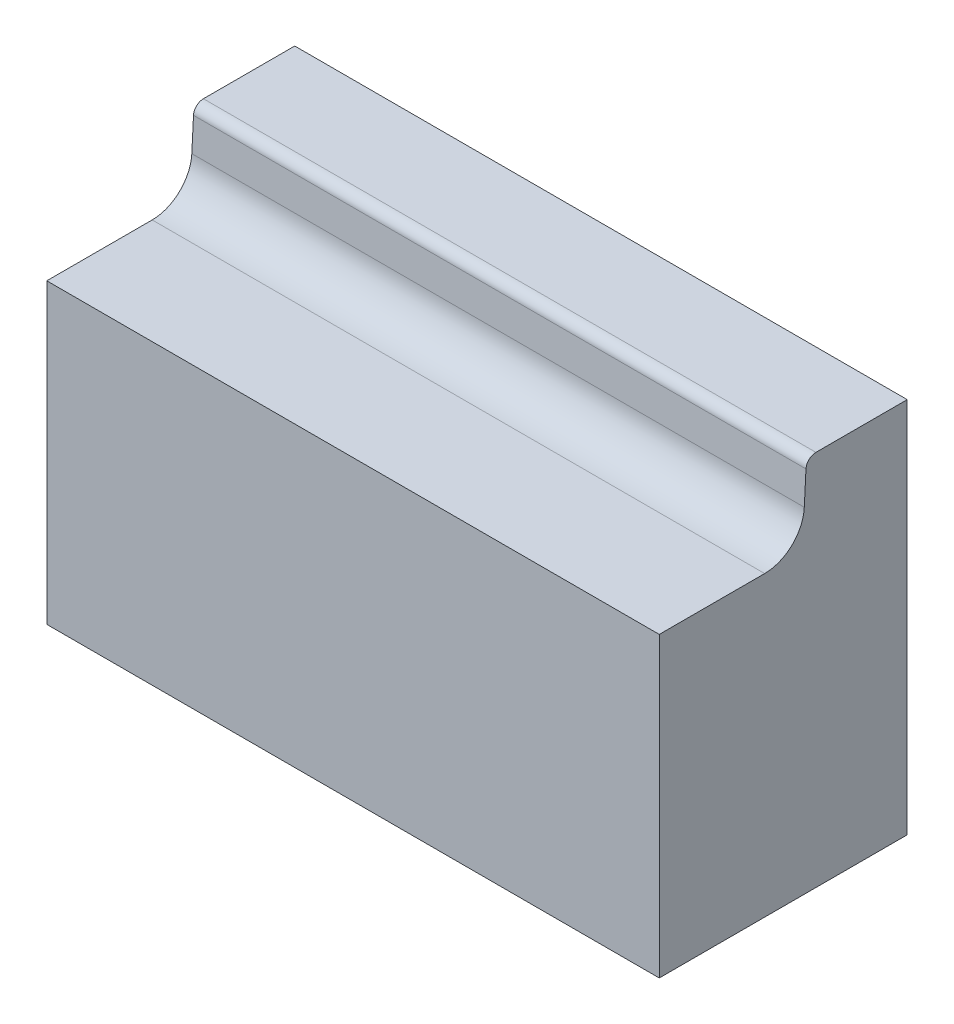
ISO-10303-21;
HEADER;
FILE_DESCRIPTION(('STEP AP214'),'2;1');
FILE_NAME('part.step','',(''),(''),'','','');
FILE_SCHEMA(('AUTOMOTIVE_DESIGN { 1 0 10303 214 1 1 1 1 }'));
ENDSEC;
DATA;
#1=APPLICATION_CONTEXT('core data for automotive mechanical design processes');
#2=APPLICATION_PROTOCOL_DEFINITION('international standard','automotive_design',2000,#1);
#3=PRODUCT_CONTEXT('',#1,'mechanical');
#4=PRODUCT('Part','Part','',(#3));
#5=PRODUCT_RELATED_PRODUCT_CATEGORY('part','',(#4));
#6=PRODUCT_DEFINITION_FORMATION('','',#4);
#7=PRODUCT_DEFINITION_CONTEXT('part definition',#1,'design');
#8=PRODUCT_DEFINITION('design','',#6,#7);
#9=PRODUCT_DEFINITION_SHAPE('','',#8);
#10=(LENGTH_UNIT() NAMED_UNIT(*) SI_UNIT(.MILLI.,.METRE.));
#11=(NAMED_UNIT(*) PLANE_ANGLE_UNIT() SI_UNIT($,.RADIAN.));
#12=(NAMED_UNIT(*) SI_UNIT($,.STERADIAN.) SOLID_ANGLE_UNIT());
#13=UNCERTAINTY_MEASURE_WITH_UNIT(LENGTH_MEASURE(1.E-05),#10,'distance_accuracy_value','');
#14=(GEOMETRIC_REPRESENTATION_CONTEXT(3) GLOBAL_UNCERTAINTY_ASSIGNED_CONTEXT((#13)) GLOBAL_UNIT_ASSIGNED_CONTEXT((#10,
#11,#12)) REPRESENTATION_CONTEXT('',''));
#15=CARTESIAN_POINT('',(0.,0.,0.));
#16=DIRECTION('',(0.,0.,1.));
#17=DIRECTION('',(1.,0.,0.));
#18=AXIS2_PLACEMENT_3D('',#15,#16,#17);
#19=CARTESIAN_POINT('',(6.10646555692893,-38.,12.5));
#20=DIRECTION('',(1.,0.,0.));
#21=DIRECTION('',(0.,0.,-1.));
#22=AXIS2_PLACEMENT_3D('',#19,#20,#21);
#23=PLANE('',#22);
#24=DIRECTION('',(0.,-0.998629534754574,0.052335956242941));
#25=VECTOR('',#24,1.);
#26=CARTESIAN_POINT('',(6.10646555692893,0.,-2.34275441810969));
#27=LINE('',#26,#25);
#28=CARTESIAN_POINT('',(6.10646555692893,-0.947664043757059,-2.29308945007));
#29=VERTEX_POINT('',#28);
#30=CARTESIAN_POINT('',(6.10646555692893,-4.20934382497176,-2.12215205600415));
#31=VERTEX_POINT('',#30);
#32=EDGE_CURVE('E154',#29,#31,#27,.T.);
#33=ORIENTED_EDGE('',*,*,#32,.F.);
#34=CARTESIAN_POINT('',(6.10646555692893,-1.,-3.29171898482457));
#35=DIRECTION('',(1.,0.,0.));
#36=DIRECTION('',(0.,0.,-1.));
#37=AXIS2_PLACEMENT_3D('',#34,#35,#36);
#38=CIRCLE('',#37,1.);
#39=CARTESIAN_POINT('',(6.10646555692893,0.,-3.29171898482457));
#40=VERTEX_POINT('',#39);
#41=EDGE_CURVE('E11',#29,#40,#38,.F.);
#42=ORIENTED_EDGE('',*,*,#41,.T.);
#43=DIRECTION('',(0.,0.,-1.));
#44=VECTOR('',#43,1.);
#45=CARTESIAN_POINT('',(6.10646555692893,0.,12.5));
#46=LINE('',#45,#44);
#47=CARTESIAN_POINT('',(6.10646555692893,0.,-12.5));
#48=VERTEX_POINT('',#47);
#49=EDGE_CURVE('E168',#40,#48,#46,.T.);
#50=ORIENTED_EDGE('',*,*,#49,.T.);
#51=DIRECTION('',(0.,-1.,0.));
#52=VECTOR('',#51,1.);
#53=CARTESIAN_POINT('',(6.10646555692893,-38.,-12.5));
#54=LINE('',#53,#52);
#55=CARTESIAN_POINT('',(6.10646555692893,-38.,-12.5));
#56=VERTEX_POINT('',#55);
#57=EDGE_CURVE('E159',#48,#56,#54,.T.);
#58=ORIENTED_EDGE('',*,*,#57,.T.);
#59=DIRECTION('',(0.,0.,-1.));
#60=VECTOR('',#59,1.);
#61=CARTESIAN_POINT('',(6.10646555692893,-38.,12.5));
#62=LINE('',#61,#60);
#63=CARTESIAN_POINT('',(6.10646555692893,-38.,12.5));
#64=VERTEX_POINT('',#63);
#65=EDGE_CURVE('E184',#64,#56,#62,.T.);
#66=ORIENTED_EDGE('',*,*,#65,.F.);
#67=DIRECTION('',(0.,-1.,0.));
#68=VECTOR('',#67,1.);
#69=CARTESIAN_POINT('',(6.10646555692893,-38.,12.5));
#70=LINE('',#69,#68);
#71=CARTESIAN_POINT('',(6.10646555692893,-8.,12.5));
#72=VERTEX_POINT('',#71);
#73=EDGE_CURVE('E160',#72,#64,#70,.T.);
#74=ORIENTED_EDGE('',*,*,#73,.F.);
#75=DIRECTION('',(0.,0.,1.));
#76=VECTOR('',#75,1.);
#77=CARTESIAN_POINT('',(6.10646555692893,-8.,12.5));
#78=LINE('',#77,#76);
#79=CARTESIAN_POINT('',(6.10646555692893,-8.,1.87236608301415));
#80=VERTEX_POINT('',#79);
#81=EDGE_CURVE('E141',#80,#72,#78,.T.);
#82=ORIENTED_EDGE('',*,*,#81,.F.);
#83=CARTESIAN_POINT('',(6.10646555692893,-4.,1.87236608301416));
#84=DIRECTION('',(1.,0.,0.));
#85=DIRECTION('',(0.,0.,-1.));
#86=AXIS2_PLACEMENT_3D('',#83,#84,#85);
#87=CIRCLE('',#86,4.);
#88=EDGE_CURVE('E138',#31,#80,#87,.F.);
#89=ORIENTED_EDGE('',*,*,#88,.F.);
#90=EDGE_LOOP('',(#33,#42,#50,#58,#66,#74,#82,#89));
#91=FACE_BOUND('',#90,.T.);
#92=ADVANCED_FACE('F49',(#91),#23,.F.);
#93=CARTESIAN_POINT('',(6.10646555692893,-38.,12.5));
#94=DIRECTION('',(0.,1.,0.));
#95=DIRECTION('',(0.,0.,1.));
#96=AXIS2_PLACEMENT_3D('',#93,#94,#95);
#97=PLANE('',#96);
#98=CARTESIAN_POINT('',(57.9814655569289,-38.,0.));
#99=DIRECTION('',(0.,-1.,0.));
#100=DIRECTION('',(0.,0.,-1.));
#101=AXIS2_PLACEMENT_3D('',#98,#99,#100);
#102=CIRCLE('',#101,2.49999999999999);
#103=CARTESIAN_POINT('',(57.9814655569289,-38.,-2.49999999999998));
#104=VERTEX_POINT('',#103);
#105=EDGE_CURVE('E128',#104,#104,#102,.T.);
#106=ORIENTED_EDGE('',*,*,#105,.F.);
#107=EDGE_LOOP('',(#106));
#108=FACE_BOUND('',#107,.T.);
#109=CARTESIAN_POINT('',(15.9814655569289,-38.,0.));
#110=DIRECTION('',(0.,-1.,0.));
#111=DIRECTION('',(0.,0.,-1.));
#112=AXIS2_PLACEMENT_3D('',#109,#110,#111);
#113=CIRCLE('',#112,2.49999999999999);
#114=CARTESIAN_POINT('',(15.9814655569289,-38.,-2.49999999999999));
#115=VERTEX_POINT('',#114);
#116=EDGE_CURVE('E127',#115,#115,#113,.T.);
#117=ORIENTED_EDGE('',*,*,#116,.F.);
#118=EDGE_LOOP('',(#117));
#119=FACE_BOUND('',#118,.T.);
#120=DIRECTION('',(1.,0.,0.));
#121=VECTOR('',#120,1.);
#122=CARTESIAN_POINT('',(6.10646555692893,-38.,-12.5));
#123=LINE('',#122,#121);
#124=CARTESIAN_POINT('',(67.8564655569289,-38.,-12.5));
#125=VERTEX_POINT('',#124);
#126=EDGE_CURVE('E171',#56,#125,#123,.T.);
#127=ORIENTED_EDGE('',*,*,#126,.T.);
#128=DIRECTION('',(0.,0.,-1.));
#129=VECTOR('',#128,1.);
#130=CARTESIAN_POINT('',(67.8564655569289,-38.,12.5));
#131=LINE('',#130,#129);
#132=CARTESIAN_POINT('',(67.8564655569289,-38.,12.5));
#133=VERTEX_POINT('',#132);
#134=EDGE_CURVE('E181',#133,#125,#131,.T.);
#135=ORIENTED_EDGE('',*,*,#134,.F.);
#136=DIRECTION('',(1.,0.,0.));
#137=VECTOR('',#136,1.);
#138=CARTESIAN_POINT('',(6.10646555692893,-38.,12.5));
#139=LINE('',#138,#137);
#140=EDGE_CURVE('E162',#64,#133,#139,.T.);
#141=ORIENTED_EDGE('',*,*,#140,.F.);
#142=ORIENTED_EDGE('',*,*,#65,.T.);
#143=EDGE_LOOP('',(#127,#135,#141,#142));
#144=FACE_BOUND('',#143,.T.);
#145=ADVANCED_FACE('F221',(#108,#119,#144),#97,.F.);
#146=CARTESIAN_POINT('',(67.8564655569289,-38.,12.5));
#147=DIRECTION('',(-1.,0.,0.));
#148=DIRECTION('',(0.,0.,1.));
#149=AXIS2_PLACEMENT_3D('',#146,#147,#148);
#150=PLANE('',#149);
#151=DIRECTION('',(0.,0.,-1.));
#152=VECTOR('',#151,1.);
#153=CARTESIAN_POINT('',(67.8564655569289,0.,12.5));
#154=LINE('',#153,#152);
#155=CARTESIAN_POINT('',(67.8564655569289,0.,-3.29171898482457));
#156=VERTEX_POINT('',#155);
#157=CARTESIAN_POINT('',(67.8564655569289,0.,-12.5));
#158=VERTEX_POINT('',#157);
#159=EDGE_CURVE('E179',#156,#158,#154,.T.);
#160=ORIENTED_EDGE('',*,*,#159,.F.);
#161=CARTESIAN_POINT('',(67.8564655569289,-1.,-3.29171898482457));
#162=DIRECTION('',(-1.,0.,0.));
#163=DIRECTION('',(0.,0.,1.));
#164=AXIS2_PLACEMENT_3D('',#161,#162,#163);
#165=CIRCLE('',#164,1.);
#166=CARTESIAN_POINT('',(67.8564655569289,-0.947664043757059,-2.29308945007));
#167=VERTEX_POINT('',#166);
#168=EDGE_CURVE('E71',#156,#167,#165,.F.);
#169=ORIENTED_EDGE('',*,*,#168,.T.);
#170=DIRECTION('',(0.,0.998629534754574,-0.0523359562429409));
#171=VECTOR('',#170,1.);
#172=CARTESIAN_POINT('',(67.8564655569289,0.,-2.34275441810969));
#173=LINE('',#172,#171);
#174=CARTESIAN_POINT('',(67.8564655569289,-4.20934382497176,-2.12215205600415));
#175=VERTEX_POINT('',#174);
#176=EDGE_CURVE('E146',#175,#167,#173,.T.);
#177=ORIENTED_EDGE('',*,*,#176,.F.);
#178=CARTESIAN_POINT('',(67.8564655569289,-4.,1.87236608301416));
#179=DIRECTION('',(1.,0.,0.));
#180=DIRECTION('',(0.,0.,-1.));
#181=AXIS2_PLACEMENT_3D('',#178,#179,#180);
#182=CIRCLE('',#181,4.);
#183=CARTESIAN_POINT('',(67.8564655569289,-8.,1.87236608301415));
#184=VERTEX_POINT('',#183);
#185=EDGE_CURVE('E143',#184,#175,#182,.T.);
#186=ORIENTED_EDGE('',*,*,#185,.F.);
#187=DIRECTION('',(0.,0.,-1.));
#188=VECTOR('',#187,1.);
#189=CARTESIAN_POINT('',(67.8564655569289,-8.,12.5));
#190=LINE('',#189,#188);
#191=CARTESIAN_POINT('',(67.8564655569289,-8.,12.5));
#192=VERTEX_POINT('',#191);
#193=EDGE_CURVE('E148',#192,#184,#190,.T.);
#194=ORIENTED_EDGE('',*,*,#193,.F.);
#195=DIRECTION('',(0.,1.,0.));
#196=VECTOR('',#195,1.);
#197=CARTESIAN_POINT('',(67.8564655569289,-38.,12.5));
#198=LINE('',#197,#196);
#199=EDGE_CURVE('E165',#133,#192,#198,.T.);
#200=ORIENTED_EDGE('',*,*,#199,.F.);
#201=ORIENTED_EDGE('',*,*,#134,.T.);
#202=DIRECTION('',(0.,1.,0.));
#203=VECTOR('',#202,1.);
#204=CARTESIAN_POINT('',(67.8564655569289,-38.,-12.5));
#205=LINE('',#204,#203);
#206=EDGE_CURVE('E173',#125,#158,#205,.T.);
#207=ORIENTED_EDGE('',*,*,#206,.T.);
#208=EDGE_LOOP('',(#160,#169,#177,#186,#194,#200,#201,#207));
#209=FACE_BOUND('',#208,.T.);
#210=ADVANCED_FACE('F196',(#209),#150,.F.);
#211=CARTESIAN_POINT('',(6.10646555692893,0.,12.5));
#212=DIRECTION('',(0.,-1.,0.));
#213=DIRECTION('',(0.,0.,-1.));
#214=AXIS2_PLACEMENT_3D('',#211,#212,#213);
#215=PLANE('',#214);
#216=ORIENTED_EDGE('',*,*,#49,.F.);
#217=DIRECTION('',(1.,0.,0.));
#218=VECTOR('',#217,1.);
#219=CARTESIAN_POINT('',(6.10646555692893,0.,-3.29171898482457));
#220=LINE('',#219,#218);
#221=EDGE_CURVE('E187',#40,#156,#220,.T.);
#222=ORIENTED_EDGE('',*,*,#221,.T.);
#223=ORIENTED_EDGE('',*,*,#159,.T.);
#224=DIRECTION('',(-1.,0.,0.));
#225=VECTOR('',#224,1.);
#226=CARTESIAN_POINT('',(6.10646555692893,0.,-12.5));
#227=LINE('',#226,#225);
#228=EDGE_CURVE('E163',#158,#48,#227,.T.);
#229=ORIENTED_EDGE('',*,*,#228,.T.);
#230=EDGE_LOOP('',(#216,#222,#223,#229));
#231=FACE_BOUND('',#230,.T.);
#232=ADVANCED_FACE('F193',(#231),#215,.F.);
#233=CARTESIAN_POINT('',(0.,0.,12.5));
#234=DIRECTION('',(0.,0.,-1.));
#235=DIRECTION('',(-1.,0.,0.));
#236=AXIS2_PLACEMENT_3D('',#233,#234,#235);
#237=PLANE('',#236);
#238=ORIENTED_EDGE('',*,*,#199,.T.);
#239=DIRECTION('',(1.,0.,0.));
#240=VECTOR('',#239,1.);
#241=CARTESIAN_POINT('',(6.10546555692892,-8.,12.5));
#242=LINE('',#241,#240);
#243=EDGE_CURVE('E155',#72,#192,#242,.T.);
#244=ORIENTED_EDGE('',*,*,#243,.F.);
#245=ORIENTED_EDGE('',*,*,#73,.T.);
#246=ORIENTED_EDGE('',*,*,#140,.T.);
#247=EDGE_LOOP('',(#238,#244,#245,#246));
#248=FACE_BOUND('',#247,.T.);
#249=ADVANCED_FACE('F233',(#248),#237,.F.);
#250=CARTESIAN_POINT('',(0.,0.,-12.5));
#251=DIRECTION('',(0.,0.,-1.));
#252=DIRECTION('',(-1.,0.,0.));
#253=AXIS2_PLACEMENT_3D('',#250,#251,#252);
#254=PLANE('',#253);
#255=ORIENTED_EDGE('',*,*,#57,.F.);
#256=ORIENTED_EDGE('',*,*,#228,.F.);
#257=ORIENTED_EDGE('',*,*,#206,.F.);
#258=ORIENTED_EDGE('',*,*,#126,.F.);
#259=EDGE_LOOP('',(#255,#256,#257,#258));
#260=FACE_BOUND('',#259,.T.);
#261=ADVANCED_FACE('F203',(#260),#254,.T.);
#262=CARTESIAN_POINT('',(6.10546555692892,-4.,1.87236608301416));
#263=DIRECTION('',(1.,0.,0.));
#264=DIRECTION('',(0.,0.,-1.));
#265=AXIS2_PLACEMENT_3D('',#262,#263,#264);
#266=CYLINDRICAL_SURFACE('',#265,4.);
#267=ORIENTED_EDGE('',*,*,#88,.T.);
#268=DIRECTION('',(1.,0.,0.));
#269=VECTOR('',#268,1.);
#270=CARTESIAN_POINT('',(6.10546555692892,-8.,1.87236608301415));
#271=LINE('',#270,#269);
#272=EDGE_CURVE('E152',#80,#184,#271,.T.);
#273=ORIENTED_EDGE('',*,*,#272,.T.);
#274=ORIENTED_EDGE('',*,*,#185,.T.);
#275=DIRECTION('',(1.,0.,0.));
#276=VECTOR('',#275,1.);
#277=CARTESIAN_POINT('',(6.10546555692892,-4.20934382497176,-2.12215205600415));
#278=LINE('',#277,#276);
#279=EDGE_CURVE('E151',#31,#175,#278,.T.);
#280=ORIENTED_EDGE('',*,*,#279,.F.);
#281=EDGE_LOOP('',(#267,#273,#274,#280));
#282=FACE_BOUND('',#281,.T.);
#283=ADVANCED_FACE('F236',(#282),#266,.F.);
#284=CARTESIAN_POINT('',(6.10546555692892,-8.,12.5));
#285=DIRECTION('',(0.,-1.,0.));
#286=DIRECTION('',(0.,0.,-1.));
#287=AXIS2_PLACEMENT_3D('',#284,#285,#286);
#288=PLANE('',#287);
#289=ORIENTED_EDGE('',*,*,#81,.T.);
#290=ORIENTED_EDGE('',*,*,#243,.T.);
#291=ORIENTED_EDGE('',*,*,#193,.T.);
#292=ORIENTED_EDGE('',*,*,#272,.F.);
#293=EDGE_LOOP('',(#289,#290,#291,#292));
#294=FACE_BOUND('',#293,.T.);
#295=ADVANCED_FACE('F218',(#294),#288,.F.);
#296=CARTESIAN_POINT('',(6.10546555692892,0.,-2.34275441810969));
#297=DIRECTION('',(0.,-0.0523359562429409,-0.998629534754574));
#298=DIRECTION('',(0.,0.998629534754574,-0.052335956242941));
#299=AXIS2_PLACEMENT_3D('',#296,#297,#298);
#300=PLANE('',#299);
#301=ORIENTED_EDGE('',*,*,#176,.T.);
#302=DIRECTION('',(1.,0.,0.));
#303=VECTOR('',#302,1.);
#304=CARTESIAN_POINT('',(6.10546555692892,-0.947664043757059,-2.29308945007));
#305=LINE('',#304,#303);
#306=EDGE_CURVE('E57',#167,#29,#305,.F.);
#307=ORIENTED_EDGE('',*,*,#306,.T.);
#308=ORIENTED_EDGE('',*,*,#32,.T.);
#309=ORIENTED_EDGE('',*,*,#279,.T.);
#310=EDGE_LOOP('',(#301,#307,#308,#309));
#311=FACE_BOUND('',#310,.T.);
#312=ADVANCED_FACE('F210',(#311),#300,.F.);
#313=CARTESIAN_POINT('',(6.10646555692893,-1.,-3.29171898482457));
#314=DIRECTION('',(1.,0.,0.));
#315=DIRECTION('',(0.,0.,-1.));
#316=AXIS2_PLACEMENT_3D('',#313,#314,#315);
#317=CYLINDRICAL_SURFACE('',#316,1.);
#318=ORIENTED_EDGE('',*,*,#41,.F.);
#319=ORIENTED_EDGE('',*,*,#306,.F.);
#320=ORIENTED_EDGE('',*,*,#168,.F.);
#321=ORIENTED_EDGE('',*,*,#221,.F.);
#322=EDGE_LOOP('',(#318,#319,#320,#321));
#323=FACE_BOUND('',#322,.T.);
#324=ADVANCED_FACE('F51',(#323),#317,.T.);
#325=CARTESIAN_POINT('',(15.9814655569289,-21.,0.));
#326=DIRECTION('',(0.,-1.,0.));
#327=DIRECTION('',(0.,0.,-1.));
#328=AXIS2_PLACEMENT_3D('',#325,#326,#327);
#329=CONICAL_SURFACE('',#328,2.49999999999999,1.02974425867665);
#330=CARTESIAN_POINT('',(15.9814655569289,-19.4978484524311,0.));
#331=VERTEX_POINT('',#330);
#332=VERTEX_LOOP('',#331);
#333=FACE_BOUND('',#332,.T.);
#334=CARTESIAN_POINT('',(15.9814655569289,-21.,0.));
#335=DIRECTION('',(0.,-1.,0.));
#336=DIRECTION('',(0.,0.,-1.));
#337=AXIS2_PLACEMENT_3D('',#334,#335,#336);
#338=CIRCLE('',#337,2.49999999999999);
#339=CARTESIAN_POINT('',(15.9814655569289,-21.,-2.49999999999999));
#340=VERTEX_POINT('',#339);
#341=EDGE_CURVE('E131',#340,#340,#338,.T.);
#342=ORIENTED_EDGE('',*,*,#341,.T.);
#343=EDGE_LOOP('',(#342));
#344=FACE_BOUND('',#343,.T.);
#345=ADVANCED_FACE('F209',(#333,#344),#329,.F.);
#346=CARTESIAN_POINT('',(15.9814655569289,-38.,0.));
#347=DIRECTION('',(0.,-1.,0.));
#348=DIRECTION('',(0.,0.,-1.));
#349=AXIS2_PLACEMENT_3D('',#346,#347,#348);
#350=CYLINDRICAL_SURFACE('',#349,2.49999999999999);
#351=ORIENTED_EDGE('',*,*,#341,.F.);
#352=EDGE_LOOP('',(#351));
#353=FACE_BOUND('',#352,.T.);
#354=ORIENTED_EDGE('',*,*,#116,.T.);
#355=EDGE_LOOP('',(#354));
#356=FACE_BOUND('',#355,.T.);
#357=ADVANCED_FACE('F121',(#353,#356),#350,.F.);
#358=CARTESIAN_POINT('',(57.9814655569289,-21.,0.));
#359=DIRECTION('',(0.,-1.,0.));
#360=DIRECTION('',(0.,0.,-1.));
#361=AXIS2_PLACEMENT_3D('',#358,#359,#360);
#362=CONICAL_SURFACE('',#361,2.49999999999999,1.02974425867665);
#363=CARTESIAN_POINT('',(57.9814655569289,-19.4978484524311,0.));
#364=VERTEX_POINT('',#363);
#365=VERTEX_LOOP('',#364);
#366=FACE_BOUND('',#365,.T.);
#367=CARTESIAN_POINT('',(57.9814655569289,-21.,0.));
#368=DIRECTION('',(0.,-1.,0.));
#369=DIRECTION('',(0.,0.,-1.));
#370=AXIS2_PLACEMENT_3D('',#367,#368,#369);
#371=CIRCLE('',#370,2.49999999999999);
#372=CARTESIAN_POINT('',(57.9814655569289,-21.,-2.49999999999998));
#373=VERTEX_POINT('',#372);
#374=EDGE_CURVE('E125',#373,#373,#371,.T.);
#375=ORIENTED_EDGE('',*,*,#374,.T.);
#376=EDGE_LOOP('',(#375));
#377=FACE_BOUND('',#376,.T.);
#378=ADVANCED_FACE('F117',(#366,#377),#362,.F.);
#379=CARTESIAN_POINT('',(57.9814655569289,-38.,0.));
#380=DIRECTION('',(0.,-1.,0.));
#381=DIRECTION('',(0.,0.,-1.));
#382=AXIS2_PLACEMENT_3D('',#379,#380,#381);
#383=CYLINDRICAL_SURFACE('',#382,2.49999999999999);
#384=ORIENTED_EDGE('',*,*,#374,.F.);
#385=EDGE_LOOP('',(#384));
#386=FACE_BOUND('',#385,.T.);
#387=ORIENTED_EDGE('',*,*,#105,.T.);
#388=EDGE_LOOP('',(#387));
#389=FACE_BOUND('',#388,.T.);
#390=ADVANCED_FACE('F120',(#386,#389),#383,.F.);
#391=CLOSED_SHELL('',(#92,#145,#210,#232,#249,#261,#283,#295,#312,#324,#345,#357,#378,#390));
#392=MANIFOLD_SOLID_BREP('B2',#391);
#393=ADVANCED_BREP_SHAPE_REPRESENTATION('',(#18,#392),#14);
#394=SHAPE_DEFINITION_REPRESENTATION(#9,#393);
ENDSEC;
END-ISO-10303-21;
